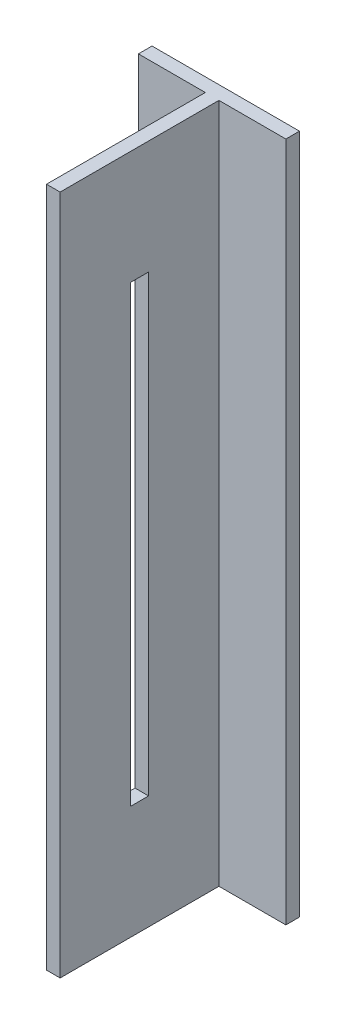
ISO-10303-21;
HEADER;
FILE_DESCRIPTION(('STEP AP214'),'2;1');
FILE_NAME('part.step','',(''),(''),'','','');
FILE_SCHEMA(('AUTOMOTIVE_DESIGN { 1 0 10303 214 1 1 1 1 }'));
ENDSEC;
DATA;
#1=APPLICATION_CONTEXT('core data for automotive mechanical design processes');
#2=APPLICATION_PROTOCOL_DEFINITION('international standard','automotive_design',2000,#1);
#3=PRODUCT_CONTEXT('',#1,'mechanical');
#4=PRODUCT('Part','Part','',(#3));
#5=PRODUCT_RELATED_PRODUCT_CATEGORY('part','',(#4));
#6=PRODUCT_DEFINITION_FORMATION('','',#4);
#7=PRODUCT_DEFINITION_CONTEXT('part definition',#1,'design');
#8=PRODUCT_DEFINITION('design','',#6,#7);
#9=PRODUCT_DEFINITION_SHAPE('','',#8);
#10=(LENGTH_UNIT() NAMED_UNIT(*) SI_UNIT(.MILLI.,.METRE.));
#11=(NAMED_UNIT(*) PLANE_ANGLE_UNIT() SI_UNIT($,.RADIAN.));
#12=(NAMED_UNIT(*) SI_UNIT($,.STERADIAN.) SOLID_ANGLE_UNIT());
#13=UNCERTAINTY_MEASURE_WITH_UNIT(LENGTH_MEASURE(1.E-05),#10,'distance_accuracy_value','');
#14=(GEOMETRIC_REPRESENTATION_CONTEXT(3) GLOBAL_UNCERTAINTY_ASSIGNED_CONTEXT((#13)) GLOBAL_UNIT_ASSIGNED_CONTEXT((#10,
#11,#12)) REPRESENTATION_CONTEXT('',''));
#15=CARTESIAN_POINT('',(0.,0.,0.));
#16=DIRECTION('',(0.,0.,1.));
#17=DIRECTION('',(1.,0.,0.));
#18=AXIS2_PLACEMENT_3D('',#15,#16,#17);
#19=CARTESIAN_POINT('',(0.,300.,-6.));
#20=DIRECTION('',(1.,0.,0.));
#21=DIRECTION('',(0.,0.,-1.));
#22=AXIS2_PLACEMENT_3D('',#19,#20,#21);
#23=PLANE('',#22);
#24=DIRECTION('',(0.,0.,1.));
#25=VECTOR('',#24,1.);
#26=CARTESIAN_POINT('',(0.,0.,-6.));
#27=LINE('',#26,#25);
#28=CARTESIAN_POINT('',(0.,0.,-6.));
#29=VERTEX_POINT('',#28);
#30=CARTESIAN_POINT('',(0.,0.,0.));
#31=VERTEX_POINT('',#30);
#32=EDGE_CURVE('E180',#29,#31,#27,.T.);
#33=ORIENTED_EDGE('',*,*,#32,.T.);
#34=DIRECTION('',(0.,-1.,0.));
#35=VECTOR('',#34,1.);
#36=CARTESIAN_POINT('',(0.,300.,0.));
#37=LINE('',#36,#35);
#38=CARTESIAN_POINT('',(0.,300.,0.));
#39=VERTEX_POINT('',#38);
#40=EDGE_CURVE('E11',#39,#31,#37,.T.);
#41=ORIENTED_EDGE('',*,*,#40,.F.);
#42=DIRECTION('',(0.,0.,1.));
#43=VECTOR('',#42,1.);
#44=CARTESIAN_POINT('',(0.,300.,-6.));
#45=LINE('',#44,#43);
#46=CARTESIAN_POINT('',(0.,300.,-6.));
#47=VERTEX_POINT('',#46);
#48=EDGE_CURVE('E181',#47,#39,#45,.T.);
#49=ORIENTED_EDGE('',*,*,#48,.F.);
#50=DIRECTION('',(0.,-1.,0.));
#51=VECTOR('',#50,1.);
#52=CARTESIAN_POINT('',(0.,300.,-6.));
#53=LINE('',#52,#51);
#54=EDGE_CURVE('E207',#47,#29,#53,.T.);
#55=ORIENTED_EDGE('',*,*,#54,.T.);
#56=EDGE_LOOP('',(#33,#41,#49,#55));
#57=FACE_BOUND('',#56,.T.);
#58=ADVANCED_FACE('F43',(#57),#23,.F.);
#59=CARTESIAN_POINT('',(0.,300.,0.));
#60=DIRECTION('',(0.,0.,-1.));
#61=DIRECTION('',(-1.,0.,0.));
#62=AXIS2_PLACEMENT_3D('',#59,#60,#61);
#63=PLANE('',#62);
#64=DIRECTION('',(1.,0.,0.));
#65=VECTOR('',#64,1.);
#66=CARTESIAN_POINT('',(0.,0.,0.));
#67=LINE('',#66,#65);
#68=CARTESIAN_POINT('',(29.5,0.,0.));
#69=VERTEX_POINT('',#68);
#70=EDGE_CURVE('E211',#31,#69,#67,.T.);
#71=ORIENTED_EDGE('',*,*,#70,.T.);
#72=DIRECTION('',(0.,-1.,0.));
#73=VECTOR('',#72,1.);
#74=CARTESIAN_POINT('',(29.5,300.,0.));
#75=LINE('',#74,#73);
#76=CARTESIAN_POINT('',(29.5,300.,0.));
#77=VERTEX_POINT('',#76);
#78=EDGE_CURVE('E51',#77,#69,#75,.T.);
#79=ORIENTED_EDGE('',*,*,#78,.F.);
#80=DIRECTION('',(1.,0.,0.));
#81=VECTOR('',#80,1.);
#82=CARTESIAN_POINT('',(0.,300.,0.));
#83=LINE('',#82,#81);
#84=EDGE_CURVE('E185',#39,#77,#83,.T.);
#85=ORIENTED_EDGE('',*,*,#84,.F.);
#86=ORIENTED_EDGE('',*,*,#40,.T.);
#87=EDGE_LOOP('',(#71,#79,#85,#86));
#88=FACE_BOUND('',#87,.T.);
#89=ADVANCED_FACE('F280',(#88),#63,.F.);
#90=CARTESIAN_POINT('',(29.5,300.,0.));
#91=DIRECTION('',(1.,0.,0.));
#92=DIRECTION('',(0.,0.,-1.));
#93=AXIS2_PLACEMENT_3D('',#90,#91,#92);
#94=PLANE('',#93);
#95=DIRECTION('',(0.,-1.,0.));
#96=VECTOR('',#95,1.);
#97=CARTESIAN_POINT('',(29.5,300.,39.));
#98=LINE('',#97,#96);
#99=CARTESIAN_POINT('',(29.5,250.,39.));
#100=VERTEX_POINT('',#99);
#101=CARTESIAN_POINT('',(29.5,50.,39.));
#102=VERTEX_POINT('',#101);
#103=EDGE_CURVE('E172',#100,#102,#98,.T.);
#104=ORIENTED_EDGE('',*,*,#103,.T.);
#105=DIRECTION('',(0.,0.,-1.));
#106=VECTOR('',#105,1.);
#107=CARTESIAN_POINT('',(29.5,50.,0.));
#108=LINE('',#107,#106);
#109=CARTESIAN_POINT('',(29.5,50.,31.));
#110=VERTEX_POINT('',#109);
#111=EDGE_CURVE('E176',#102,#110,#108,.T.);
#112=ORIENTED_EDGE('',*,*,#111,.T.);
#113=DIRECTION('',(0.,1.,0.));
#114=VECTOR('',#113,1.);
#115=CARTESIAN_POINT('',(29.5,300.,31.));
#116=LINE('',#115,#114);
#117=CARTESIAN_POINT('',(29.5,250.,31.));
#118=VERTEX_POINT('',#117);
#119=EDGE_CURVE('E163',#110,#118,#116,.T.);
#120=ORIENTED_EDGE('',*,*,#119,.T.);
#121=DIRECTION('',(0.,0.,1.));
#122=VECTOR('',#121,1.);
#123=CARTESIAN_POINT('',(29.5,250.,0.));
#124=LINE('',#123,#122);
#125=EDGE_CURVE('E138',#118,#100,#124,.T.);
#126=ORIENTED_EDGE('',*,*,#125,.T.);
#127=EDGE_LOOP('',(#104,#112,#120,#126));
#128=FACE_BOUND('',#127,.T.);
#129=DIRECTION('',(0.,0.,1.));
#130=VECTOR('',#129,1.);
#131=CARTESIAN_POINT('',(29.5,0.,0.));
#132=LINE('',#131,#130);
#133=CARTESIAN_POINT('',(29.5,0.,70.));
#134=VERTEX_POINT('',#133);
#135=EDGE_CURVE('E214',#69,#134,#132,.T.);
#136=ORIENTED_EDGE('',*,*,#135,.T.);
#137=DIRECTION('',(0.,-1.,0.));
#138=VECTOR('',#137,1.);
#139=CARTESIAN_POINT('',(29.5,300.,70.));
#140=LINE('',#139,#138);
#141=CARTESIAN_POINT('',(29.5,300.,70.));
#142=VERTEX_POINT('',#141);
#143=EDGE_CURVE('E250',#142,#134,#140,.T.);
#144=ORIENTED_EDGE('',*,*,#143,.F.);
#145=DIRECTION('',(0.,0.,1.));
#146=VECTOR('',#145,1.);
#147=CARTESIAN_POINT('',(29.5,300.,0.));
#148=LINE('',#147,#146);
#149=EDGE_CURVE('E189',#77,#142,#148,.T.);
#150=ORIENTED_EDGE('',*,*,#149,.F.);
#151=ORIENTED_EDGE('',*,*,#78,.T.);
#152=EDGE_LOOP('',(#136,#144,#150,#151));
#153=FACE_BOUND('',#152,.T.);
#154=ADVANCED_FACE('F259',(#128,#153),#94,.F.);
#155=CARTESIAN_POINT('',(29.5,300.,70.));
#156=DIRECTION('',(0.,0.,-1.));
#157=DIRECTION('',(-1.,0.,0.));
#158=AXIS2_PLACEMENT_3D('',#155,#156,#157);
#159=PLANE('',#158);
#160=DIRECTION('',(1.,0.,0.));
#161=VECTOR('',#160,1.);
#162=CARTESIAN_POINT('',(29.5,0.,70.));
#163=LINE('',#162,#161);
#164=CARTESIAN_POINT('',(35.5,0.,70.));
#165=VERTEX_POINT('',#164);
#166=EDGE_CURVE('E217',#134,#165,#163,.T.);
#167=ORIENTED_EDGE('',*,*,#166,.T.);
#168=DIRECTION('',(0.,-1.,0.));
#169=VECTOR('',#168,1.);
#170=CARTESIAN_POINT('',(35.5,300.,70.));
#171=LINE('',#170,#169);
#172=CARTESIAN_POINT('',(35.5,300.,70.));
#173=VERTEX_POINT('',#172);
#174=EDGE_CURVE('E246',#173,#165,#171,.T.);
#175=ORIENTED_EDGE('',*,*,#174,.F.);
#176=DIRECTION('',(1.,0.,0.));
#177=VECTOR('',#176,1.);
#178=CARTESIAN_POINT('',(29.5,300.,70.));
#179=LINE('',#178,#177);
#180=EDGE_CURVE('E192',#142,#173,#179,.T.);
#181=ORIENTED_EDGE('',*,*,#180,.F.);
#182=ORIENTED_EDGE('',*,*,#143,.T.);
#183=EDGE_LOOP('',(#167,#175,#181,#182));
#184=FACE_BOUND('',#183,.T.);
#185=ADVANCED_FACE('F270',(#184),#159,.F.);
#186=CARTESIAN_POINT('',(35.5,300.,70.));
#187=DIRECTION('',(-1.,0.,0.));
#188=DIRECTION('',(0.,0.,1.));
#189=AXIS2_PLACEMENT_3D('',#186,#187,#188);
#190=PLANE('',#189);
#191=DIRECTION('',(0.,1.,0.));
#192=VECTOR('',#191,1.);
#193=CARTESIAN_POINT('',(35.5,250.,31.));
#194=LINE('',#193,#192);
#195=CARTESIAN_POINT('',(35.5,49.9999999999999,31.));
#196=VERTEX_POINT('',#195);
#197=CARTESIAN_POINT('',(35.5,250.,31.));
#198=VERTEX_POINT('',#197);
#199=EDGE_CURVE('E145',#196,#198,#194,.T.);
#200=ORIENTED_EDGE('',*,*,#199,.F.);
#201=DIRECTION('',(0.,0.,-1.));
#202=VECTOR('',#201,1.);
#203=CARTESIAN_POINT('',(35.5,50.,31.));
#204=LINE('',#203,#202);
#205=CARTESIAN_POINT('',(35.5,50.,39.));
#206=VERTEX_POINT('',#205);
#207=EDGE_CURVE('E66',#206,#196,#204,.T.);
#208=ORIENTED_EDGE('',*,*,#207,.F.);
#209=DIRECTION('',(0.,-1.,0.));
#210=VECTOR('',#209,1.);
#211=CARTESIAN_POINT('',(35.5,50.,39.));
#212=LINE('',#211,#210);
#213=CARTESIAN_POINT('',(35.5,250.,39.));
#214=VERTEX_POINT('',#213);
#215=EDGE_CURVE('E153',#214,#206,#212,.T.);
#216=ORIENTED_EDGE('',*,*,#215,.F.);
#217=DIRECTION('',(0.,0.,1.));
#218=VECTOR('',#217,1.);
#219=CARTESIAN_POINT('',(35.5,250.,31.));
#220=LINE('',#219,#218);
#221=EDGE_CURVE('E135',#198,#214,#220,.T.);
#222=ORIENTED_EDGE('',*,*,#221,.F.);
#223=EDGE_LOOP('',(#200,#208,#216,#222));
#224=FACE_BOUND('',#223,.T.);
#225=DIRECTION('',(0.,0.,-1.));
#226=VECTOR('',#225,1.);
#227=CARTESIAN_POINT('',(35.5,0.,70.));
#228=LINE('',#227,#226);
#229=CARTESIAN_POINT('',(35.5,0.,0.));
#230=VERTEX_POINT('',#229);
#231=EDGE_CURVE('E220',#165,#230,#228,.T.);
#232=ORIENTED_EDGE('',*,*,#231,.T.);
#233=DIRECTION('',(0.,-1.,0.));
#234=VECTOR('',#233,1.);
#235=CARTESIAN_POINT('',(35.5,300.,0.));
#236=LINE('',#235,#234);
#237=CARTESIAN_POINT('',(35.5,300.,0.));
#238=VERTEX_POINT('',#237);
#239=EDGE_CURVE('E242',#238,#230,#236,.T.);
#240=ORIENTED_EDGE('',*,*,#239,.F.);
#241=DIRECTION('',(0.,0.,-1.));
#242=VECTOR('',#241,1.);
#243=CARTESIAN_POINT('',(35.5,300.,70.));
#244=LINE('',#243,#242);
#245=EDGE_CURVE('E195',#173,#238,#244,.T.);
#246=ORIENTED_EDGE('',*,*,#245,.F.);
#247=ORIENTED_EDGE('',*,*,#174,.T.);
#248=EDGE_LOOP('',(#232,#240,#246,#247));
#249=FACE_BOUND('',#248,.T.);
#250=ADVANCED_FACE('F150',(#224,#249),#190,.F.);
#251=CARTESIAN_POINT('',(35.5,300.,0.));
#252=DIRECTION('',(0.,0.,-1.));
#253=DIRECTION('',(-1.,0.,0.));
#254=AXIS2_PLACEMENT_3D('',#251,#252,#253);
#255=PLANE('',#254);
#256=DIRECTION('',(1.,0.,0.));
#257=VECTOR('',#256,1.);
#258=CARTESIAN_POINT('',(35.5,0.,0.));
#259=LINE('',#258,#257);
#260=CARTESIAN_POINT('',(65.,0.,0.));
#261=VERTEX_POINT('',#260);
#262=EDGE_CURVE('E223',#230,#261,#259,.T.);
#263=ORIENTED_EDGE('',*,*,#262,.T.);
#264=DIRECTION('',(0.,-1.,0.));
#265=VECTOR('',#264,1.);
#266=CARTESIAN_POINT('',(65.,300.,0.));
#267=LINE('',#266,#265);
#268=CARTESIAN_POINT('',(65.,300.,0.));
#269=VERTEX_POINT('',#268);
#270=EDGE_CURVE('E238',#269,#261,#267,.T.);
#271=ORIENTED_EDGE('',*,*,#270,.F.);
#272=DIRECTION('',(1.,0.,0.));
#273=VECTOR('',#272,1.);
#274=CARTESIAN_POINT('',(35.5,300.,0.));
#275=LINE('',#274,#273);
#276=EDGE_CURVE('E198',#238,#269,#275,.T.);
#277=ORIENTED_EDGE('',*,*,#276,.F.);
#278=ORIENTED_EDGE('',*,*,#239,.T.);
#279=EDGE_LOOP('',(#263,#271,#277,#278));
#280=FACE_BOUND('',#279,.T.);
#281=ADVANCED_FACE('F293',(#280),#255,.F.);
#282=CARTESIAN_POINT('',(65.,300.,0.));
#283=DIRECTION('',(-1.,0.,0.));
#284=DIRECTION('',(0.,0.,1.));
#285=AXIS2_PLACEMENT_3D('',#282,#283,#284);
#286=PLANE('',#285);
#287=DIRECTION('',(0.,0.,-1.));
#288=VECTOR('',#287,1.);
#289=CARTESIAN_POINT('',(65.,0.,0.));
#290=LINE('',#289,#288);
#291=CARTESIAN_POINT('',(65.,0.,-6.00000000000001));
#292=VERTEX_POINT('',#291);
#293=EDGE_CURVE('E226',#261,#292,#290,.T.);
#294=ORIENTED_EDGE('',*,*,#293,.T.);
#295=DIRECTION('',(0.,-1.,0.));
#296=VECTOR('',#295,1.);
#297=CARTESIAN_POINT('',(65.,300.,-6.00000000000001));
#298=LINE('',#297,#296);
#299=CARTESIAN_POINT('',(65.,300.,-6.00000000000001));
#300=VERTEX_POINT('',#299);
#301=EDGE_CURVE('E234',#300,#292,#298,.T.);
#302=ORIENTED_EDGE('',*,*,#301,.F.);
#303=DIRECTION('',(0.,0.,-1.));
#304=VECTOR('',#303,1.);
#305=CARTESIAN_POINT('',(65.,300.,0.));
#306=LINE('',#305,#304);
#307=EDGE_CURVE('E201',#269,#300,#306,.T.);
#308=ORIENTED_EDGE('',*,*,#307,.F.);
#309=ORIENTED_EDGE('',*,*,#270,.T.);
#310=EDGE_LOOP('',(#294,#302,#308,#309));
#311=FACE_BOUND('',#310,.T.);
#312=ADVANCED_FACE('F291',(#311),#286,.F.);
#313=CARTESIAN_POINT('',(65.,300.,-6.00000000000001));
#314=DIRECTION('',(0.,0.,1.));
#315=DIRECTION('',(1.,0.,0.));
#316=AXIS2_PLACEMENT_3D('',#313,#314,#315);
#317=PLANE('',#316);
#318=DIRECTION('',(-1.,0.,0.));
#319=VECTOR('',#318,1.);
#320=CARTESIAN_POINT('',(65.,0.,-6.00000000000001));
#321=LINE('',#320,#319);
#322=EDGE_CURVE('E186',#292,#29,#321,.T.);
#323=ORIENTED_EDGE('',*,*,#322,.T.);
#324=ORIENTED_EDGE('',*,*,#54,.F.);
#325=DIRECTION('',(-1.,0.,0.));
#326=VECTOR('',#325,1.);
#327=CARTESIAN_POINT('',(65.,300.,-6.00000000000001));
#328=LINE('',#327,#326);
#329=EDGE_CURVE('E204',#300,#47,#328,.T.);
#330=ORIENTED_EDGE('',*,*,#329,.F.);
#331=ORIENTED_EDGE('',*,*,#301,.T.);
#332=EDGE_LOOP('',(#323,#324,#330,#331));
#333=FACE_BOUND('',#332,.T.);
#334=ADVANCED_FACE('F286',(#333),#317,.F.);
#335=CARTESIAN_POINT('',(0.,300.,0.));
#336=DIRECTION('',(0.,1.,0.));
#337=DIRECTION('',(0.,0.,1.));
#338=AXIS2_PLACEMENT_3D('',#335,#336,#337);
#339=PLANE('',#338);
#340=ORIENTED_EDGE('',*,*,#48,.T.);
#341=ORIENTED_EDGE('',*,*,#84,.T.);
#342=ORIENTED_EDGE('',*,*,#149,.T.);
#343=ORIENTED_EDGE('',*,*,#180,.T.);
#344=ORIENTED_EDGE('',*,*,#245,.T.);
#345=ORIENTED_EDGE('',*,*,#276,.T.);
#346=ORIENTED_EDGE('',*,*,#307,.T.);
#347=ORIENTED_EDGE('',*,*,#329,.T.);
#348=EDGE_LOOP('',(#340,#341,#342,#343,#344,#345,#346,#347));
#349=FACE_BOUND('',#348,.T.);
#350=ADVANCED_FACE('F276',(#349),#339,.T.);
#351=CARTESIAN_POINT('',(0.,0.,0.));
#352=DIRECTION('',(0.,1.,0.));
#353=DIRECTION('',(0.,0.,1.));
#354=AXIS2_PLACEMENT_3D('',#351,#352,#353);
#355=PLANE('',#354);
#356=ORIENTED_EDGE('',*,*,#32,.F.);
#357=ORIENTED_EDGE('',*,*,#322,.F.);
#358=ORIENTED_EDGE('',*,*,#293,.F.);
#359=ORIENTED_EDGE('',*,*,#262,.F.);
#360=ORIENTED_EDGE('',*,*,#231,.F.);
#361=ORIENTED_EDGE('',*,*,#166,.F.);
#362=ORIENTED_EDGE('',*,*,#135,.F.);
#363=ORIENTED_EDGE('',*,*,#70,.F.);
#364=EDGE_LOOP('',(#356,#357,#358,#359,#360,#361,#362,#363));
#365=FACE_BOUND('',#364,.T.);
#366=ADVANCED_FACE('F265',(#365),#355,.F.);
#367=CARTESIAN_POINT('',(0.,50.,31.));
#368=DIRECTION('',(0.,-1.,0.));
#369=DIRECTION('',(0.,0.,-1.));
#370=AXIS2_PLACEMENT_3D('',#367,#368,#369);
#371=PLANE('',#370);
#372=DIRECTION('',(1.,0.,0.));
#373=VECTOR('',#372,1.);
#374=CARTESIAN_POINT('',(0.,50.,39.));
#375=LINE('',#374,#373);
#376=EDGE_CURVE('E160',#102,#206,#375,.T.);
#377=ORIENTED_EDGE('',*,*,#376,.T.);
#378=ORIENTED_EDGE('',*,*,#207,.T.);
#379=DIRECTION('',(1.,0.,0.));
#380=VECTOR('',#379,1.);
#381=CARTESIAN_POINT('',(0.,50.,31.));
#382=LINE('',#381,#380);
#383=EDGE_CURVE('E142',#110,#196,#382,.T.);
#384=ORIENTED_EDGE('',*,*,#383,.F.);
#385=ORIENTED_EDGE('',*,*,#111,.F.);
#386=EDGE_LOOP('',(#377,#378,#384,#385));
#387=FACE_BOUND('',#386,.T.);
#388=ADVANCED_FACE('F348',(#387),#371,.F.);
#389=CARTESIAN_POINT('',(0.,50.,39.));
#390=DIRECTION('',(0.,0.,1.));
#391=DIRECTION('',(0.,-1.,0.));
#392=AXIS2_PLACEMENT_3D('',#389,#390,#391);
#393=PLANE('',#392);
#394=DIRECTION('',(1.,0.,0.));
#395=VECTOR('',#394,1.);
#396=CARTESIAN_POINT('',(0.,250.,39.));
#397=LINE('',#396,#395);
#398=EDGE_CURVE('E141',#100,#214,#397,.T.);
#399=ORIENTED_EDGE('',*,*,#398,.T.);
#400=ORIENTED_EDGE('',*,*,#215,.T.);
#401=ORIENTED_EDGE('',*,*,#376,.F.);
#402=ORIENTED_EDGE('',*,*,#103,.F.);
#403=EDGE_LOOP('',(#399,#400,#401,#402));
#404=FACE_BOUND('',#403,.T.);
#405=ADVANCED_FACE('F354',(#404),#393,.F.);
#406=CARTESIAN_POINT('',(0.,250.,31.));
#407=DIRECTION('',(0.,1.,0.));
#408=DIRECTION('',(0.,0.,1.));
#409=AXIS2_PLACEMENT_3D('',#406,#407,#408);
#410=PLANE('',#409);
#411=DIRECTION('',(1.,0.,0.));
#412=VECTOR('',#411,1.);
#413=CARTESIAN_POINT('',(0.,250.,31.));
#414=LINE('',#413,#412);
#415=EDGE_CURVE('E58',#118,#198,#414,.T.);
#416=ORIENTED_EDGE('',*,*,#415,.T.);
#417=ORIENTED_EDGE('',*,*,#221,.T.);
#418=ORIENTED_EDGE('',*,*,#398,.F.);
#419=ORIENTED_EDGE('',*,*,#125,.F.);
#420=EDGE_LOOP('',(#416,#417,#418,#419));
#421=FACE_BOUND('',#420,.T.);
#422=ADVANCED_FACE('F132',(#421),#410,.F.);
#423=CARTESIAN_POINT('',(0.,250.,31.));
#424=DIRECTION('',(0.,0.,-1.));
#425=DIRECTION('',(-1.,0.,0.));
#426=AXIS2_PLACEMENT_3D('',#423,#424,#425);
#427=PLANE('',#426);
#428=ORIENTED_EDGE('',*,*,#383,.T.);
#429=ORIENTED_EDGE('',*,*,#199,.T.);
#430=ORIENTED_EDGE('',*,*,#415,.F.);
#431=ORIENTED_EDGE('',*,*,#119,.F.);
#432=EDGE_LOOP('',(#428,#429,#430,#431));
#433=FACE_BOUND('',#432,.T.);
#434=ADVANCED_FACE('F146',(#433),#427,.F.);
#435=CLOSED_SHELL('',(#58,#89,#154,#185,#250,#281,#312,#334,#350,#366,#388,#405,#422,#434));
#436=MANIFOLD_SOLID_BREP('B2',#435);
#437=ADVANCED_BREP_SHAPE_REPRESENTATION('',(#18,#436),#14);
#438=SHAPE_DEFINITION_REPRESENTATION(#9,#437);
ENDSEC;
END-ISO-10303-21;
